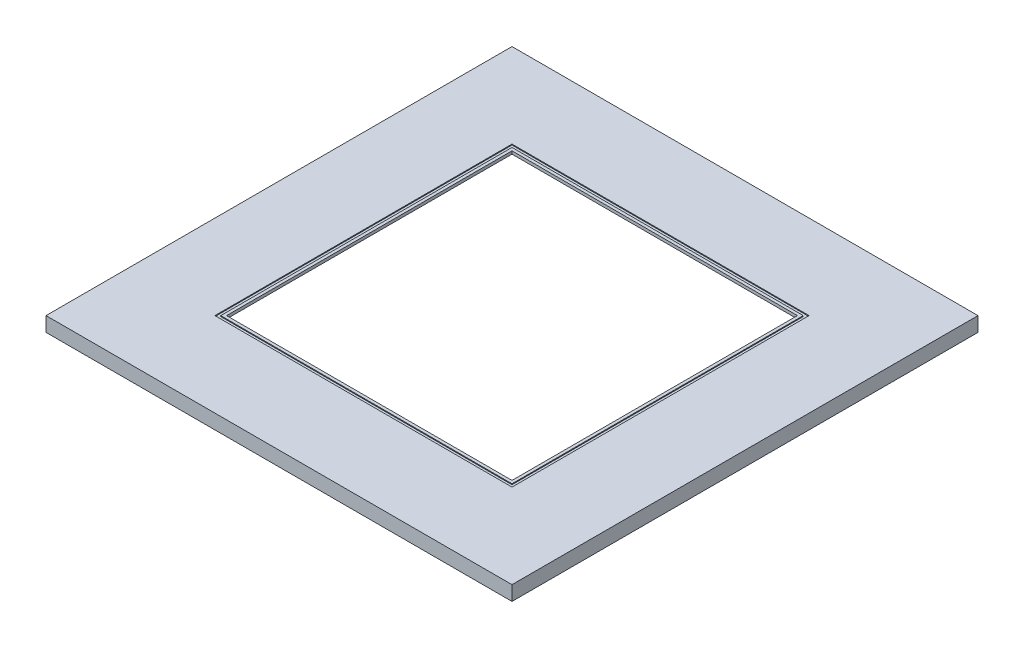
ISO-10303-21;
HEADER;
FILE_DESCRIPTION(('STEP AP214'),'2;1');
FILE_NAME('part.step','',(''),(''),'','','');
FILE_SCHEMA(('AUTOMOTIVE_DESIGN { 1 0 10303 214 1 1 1 1 }'));
ENDSEC;
DATA;
#1=APPLICATION_CONTEXT('core data for automotive mechanical design processes');
#2=APPLICATION_PROTOCOL_DEFINITION('international standard','automotive_design',2000,#1);
#3=PRODUCT_CONTEXT('',#1,'mechanical');
#4=PRODUCT('Part','Part','',(#3));
#5=PRODUCT_RELATED_PRODUCT_CATEGORY('part','',(#4));
#6=PRODUCT_DEFINITION_FORMATION('','',#4);
#7=PRODUCT_DEFINITION_CONTEXT('part definition',#1,'design');
#8=PRODUCT_DEFINITION('design','',#6,#7);
#9=PRODUCT_DEFINITION_SHAPE('','',#8);
#10=(LENGTH_UNIT() NAMED_UNIT(*) SI_UNIT(.MILLI.,.METRE.));
#11=(NAMED_UNIT(*) PLANE_ANGLE_UNIT() SI_UNIT($,.RADIAN.));
#12=(NAMED_UNIT(*) SI_UNIT($,.STERADIAN.) SOLID_ANGLE_UNIT());
#13=UNCERTAINTY_MEASURE_WITH_UNIT(LENGTH_MEASURE(1.E-05),#10,'distance_accuracy_value','');
#14=(GEOMETRIC_REPRESENTATION_CONTEXT(3) GLOBAL_UNCERTAINTY_ASSIGNED_CONTEXT((#13)) GLOBAL_UNIT_ASSIGNED_CONTEXT((#10,
#11,#12)) REPRESENTATION_CONTEXT('',''));
#15=CARTESIAN_POINT('',(0.,0.,0.));
#16=DIRECTION('',(0.,0.,1.));
#17=DIRECTION('',(1.,0.,0.));
#18=AXIS2_PLACEMENT_3D('',#15,#16,#17);
#19=CARTESIAN_POINT('',(0.,5.,0.));
#20=DIRECTION('',(0.,1.,0.));
#21=DIRECTION('',(0.,0.,1.));
#22=AXIS2_PLACEMENT_3D('',#19,#20,#21);
#23=PLANE('',#22);
#24=DIRECTION('',(0.,0.,1.));
#25=VECTOR('',#24,1.);
#26=CARTESIAN_POINT('',(26.,5.,-124.));
#27=LINE('',#26,#25);
#28=CARTESIAN_POINT('',(26.,5.,-124.));
#29=VERTEX_POINT('',#28);
#30=CARTESIAN_POINT('',(26.,5.,-26.));
#31=VERTEX_POINT('',#30);
#32=EDGE_CURVE('E236',#29,#31,#27,.T.);
#33=ORIENTED_EDGE('',*,*,#32,.F.);
#34=DIRECTION('',(-1.,0.,0.));
#35=VECTOR('',#34,1.);
#36=CARTESIAN_POINT('',(124.,5.,-124.));
#37=LINE('',#36,#35);
#38=CARTESIAN_POINT('',(124.,5.,-124.));
#39=VERTEX_POINT('',#38);
#40=EDGE_CURVE('E246',#39,#29,#37,.T.);
#41=ORIENTED_EDGE('',*,*,#40,.F.);
#42=DIRECTION('',(0.,0.,-1.));
#43=VECTOR('',#42,1.);
#44=CARTESIAN_POINT('',(124.,5.,-26.));
#45=LINE('',#44,#43);
#46=CARTESIAN_POINT('',(124.,5.,-26.));
#47=VERTEX_POINT('',#46);
#48=EDGE_CURVE('E260',#47,#39,#45,.T.);
#49=ORIENTED_EDGE('',*,*,#48,.F.);
#50=DIRECTION('',(1.,0.,0.));
#51=VECTOR('',#50,1.);
#52=CARTESIAN_POINT('',(26.,5.,-26.));
#53=LINE('',#52,#51);
#54=EDGE_CURVE('E257',#31,#47,#53,.T.);
#55=ORIENTED_EDGE('',*,*,#54,.F.);
#56=EDGE_LOOP('',(#33,#41,#49,#55));
#57=FACE_BOUND('',#56,.T.);
#58=DIRECTION('',(-1.,0.,0.));
#59=VECTOR('',#58,1.);
#60=CARTESIAN_POINT('',(125.,5.,-125.));
#61=LINE('',#60,#59);
#62=CARTESIAN_POINT('',(125.,5.,-125.));
#63=VERTEX_POINT('',#62);
#64=CARTESIAN_POINT('',(25.,5.,-125.));
#65=VERTEX_POINT('',#64);
#66=EDGE_CURVE('E196',#63,#65,#61,.T.);
#67=ORIENTED_EDGE('',*,*,#66,.T.);
#68=DIRECTION('',(0.,0.,1.));
#69=VECTOR('',#68,1.);
#70=CARTESIAN_POINT('',(25.,5.,-125.));
#71=LINE('',#70,#69);
#72=CARTESIAN_POINT('',(25.,5.,-25.));
#73=VERTEX_POINT('',#72);
#74=EDGE_CURVE('E203',#65,#73,#71,.T.);
#75=ORIENTED_EDGE('',*,*,#74,.T.);
#76=DIRECTION('',(1.,0.,0.));
#77=VECTOR('',#76,1.);
#78=CARTESIAN_POINT('',(25.,5.,-25.));
#79=LINE('',#78,#77);
#80=CARTESIAN_POINT('',(125.,5.,-25.));
#81=VERTEX_POINT('',#80);
#82=EDGE_CURVE('E176',#73,#81,#79,.T.);
#83=ORIENTED_EDGE('',*,*,#82,.T.);
#84=DIRECTION('',(0.,0.,-1.));
#85=VECTOR('',#84,1.);
#86=CARTESIAN_POINT('',(125.,5.,-25.));
#87=LINE('',#86,#85);
#88=EDGE_CURVE('E56',#81,#63,#87,.T.);
#89=ORIENTED_EDGE('',*,*,#88,.T.);
#90=EDGE_LOOP('',(#67,#75,#83,#89));
#91=FACE_BOUND('',#90,.T.);
#92=ADVANCED_FACE('F33',(#57,#91),#23,.T.);
#93=CARTESIAN_POINT('',(0.,5.,0.));
#94=DIRECTION('',(1.,0.,0.));
#95=DIRECTION('',(0.,0.,-1.));
#96=AXIS2_PLACEMENT_3D('',#93,#94,#95);
#97=PLANE('',#96);
#98=DIRECTION('',(0.,-1.,0.));
#99=VECTOR('',#98,1.);
#100=CARTESIAN_POINT('',(0.,5.,-150.));
#101=LINE('',#100,#99);
#102=CARTESIAN_POINT('',(0.,4.,-150.));
#103=VERTEX_POINT('',#102);
#104=CARTESIAN_POINT('',(0.,0.,-150.));
#105=VERTEX_POINT('',#104);
#106=EDGE_CURVE('E297',#103,#105,#101,.T.);
#107=ORIENTED_EDGE('',*,*,#106,.F.);
#108=DIRECTION('',(0.,0.,1.));
#109=VECTOR('',#108,1.);
#110=CARTESIAN_POINT('',(0.,4.,-150.));
#111=LINE('',#110,#109);
#112=CARTESIAN_POINT('',(0.,4.,0.));
#113=VERTEX_POINT('',#112);
#114=EDGE_CURVE('E267',#103,#113,#111,.T.);
#115=ORIENTED_EDGE('',*,*,#114,.T.);
#116=DIRECTION('',(0.,-1.,0.));
#117=VECTOR('',#116,1.);
#118=CARTESIAN_POINT('',(0.,5.,0.));
#119=LINE('',#118,#117);
#120=CARTESIAN_POINT('',(0.,0.,0.));
#121=VERTEX_POINT('',#120);
#122=EDGE_CURVE('E303',#113,#121,#119,.T.);
#123=ORIENTED_EDGE('',*,*,#122,.T.);
#124=DIRECTION('',(0.,0.,1.));
#125=VECTOR('',#124,1.);
#126=CARTESIAN_POINT('',(0.,0.,0.));
#127=LINE('',#126,#125);
#128=EDGE_CURVE('E285',#105,#121,#127,.T.);
#129=ORIENTED_EDGE('',*,*,#128,.F.);
#130=EDGE_LOOP('',(#107,#115,#123,#129));
#131=FACE_BOUND('',#130,.T.);
#132=ADVANCED_FACE('F358',(#131),#97,.T.);
#133=CARTESIAN_POINT('',(0.,5.,0.));
#134=DIRECTION('',(0.,0.,-1.));
#135=DIRECTION('',(-1.,0.,0.));
#136=AXIS2_PLACEMENT_3D('',#133,#134,#135);
#137=PLANE('',#136);
#138=ORIENTED_EDGE('',*,*,#122,.F.);
#139=DIRECTION('',(1.,0.,0.));
#140=VECTOR('',#139,1.);
#141=CARTESIAN_POINT('',(0.,4.,0.));
#142=LINE('',#141,#140);
#143=CARTESIAN_POINT('',(150.,4.,0.));
#144=VERTEX_POINT('',#143);
#145=EDGE_CURVE('E276',#113,#144,#142,.T.);
#146=ORIENTED_EDGE('',*,*,#145,.T.);
#147=DIRECTION('',(0.,-1.,0.));
#148=VECTOR('',#147,1.);
#149=CARTESIAN_POINT('',(150.,5.,0.));
#150=LINE('',#149,#148);
#151=CARTESIAN_POINT('',(150.,0.,0.));
#152=VERTEX_POINT('',#151);
#153=EDGE_CURVE('E301',#144,#152,#150,.T.);
#154=ORIENTED_EDGE('',*,*,#153,.T.);
#155=DIRECTION('',(1.,0.,0.));
#156=VECTOR('',#155,1.);
#157=CARTESIAN_POINT('',(0.,0.,0.));
#158=LINE('',#157,#156);
#159=EDGE_CURVE('E288',#121,#152,#158,.T.);
#160=ORIENTED_EDGE('',*,*,#159,.F.);
#161=EDGE_LOOP('',(#138,#146,#154,#160));
#162=FACE_BOUND('',#161,.T.);
#163=ADVANCED_FACE('F364',(#162),#137,.T.);
#164=CARTESIAN_POINT('',(150.,5.,0.));
#165=DIRECTION('',(-1.,0.,0.));
#166=DIRECTION('',(0.,0.,1.));
#167=AXIS2_PLACEMENT_3D('',#164,#165,#166);
#168=PLANE('',#167);
#169=ORIENTED_EDGE('',*,*,#153,.F.);
#170=DIRECTION('',(0.,0.,-1.));
#171=VECTOR('',#170,1.);
#172=CARTESIAN_POINT('',(150.,4.,0.));
#173=LINE('',#172,#171);
#174=CARTESIAN_POINT('',(150.,4.,-150.));
#175=VERTEX_POINT('',#174);
#176=EDGE_CURVE('E279',#144,#175,#173,.T.);
#177=ORIENTED_EDGE('',*,*,#176,.T.);
#178=DIRECTION('',(0.,-1.,0.));
#179=VECTOR('',#178,1.);
#180=CARTESIAN_POINT('',(150.,5.,-150.));
#181=LINE('',#180,#179);
#182=CARTESIAN_POINT('',(150.,0.,-150.));
#183=VERTEX_POINT('',#182);
#184=EDGE_CURVE('E299',#175,#183,#181,.T.);
#185=ORIENTED_EDGE('',*,*,#184,.T.);
#186=DIRECTION('',(0.,0.,-1.));
#187=VECTOR('',#186,1.);
#188=CARTESIAN_POINT('',(150.,0.,0.));
#189=LINE('',#188,#187);
#190=EDGE_CURVE('E291',#152,#183,#189,.T.);
#191=ORIENTED_EDGE('',*,*,#190,.F.);
#192=EDGE_LOOP('',(#169,#177,#185,#191));
#193=FACE_BOUND('',#192,.T.);
#194=ADVANCED_FACE('F377',(#193),#168,.T.);
#195=CARTESIAN_POINT('',(0.,5.,-150.));
#196=DIRECTION('',(0.,0.,1.));
#197=DIRECTION('',(1.,0.,0.));
#198=AXIS2_PLACEMENT_3D('',#195,#196,#197);
#199=PLANE('',#198);
#200=ORIENTED_EDGE('',*,*,#184,.F.);
#201=DIRECTION('',(-1.,0.,0.));
#202=VECTOR('',#201,1.);
#203=CARTESIAN_POINT('',(150.,4.,-150.));
#204=LINE('',#203,#202);
#205=EDGE_CURVE('E282',#175,#103,#204,.T.);
#206=ORIENTED_EDGE('',*,*,#205,.T.);
#207=ORIENTED_EDGE('',*,*,#106,.T.);
#208=DIRECTION('',(-1.,0.,0.));
#209=VECTOR('',#208,1.);
#210=CARTESIAN_POINT('',(0.,0.,-150.));
#211=LINE('',#210,#209);
#212=EDGE_CURVE('E294',#183,#105,#211,.T.);
#213=ORIENTED_EDGE('',*,*,#212,.F.);
#214=EDGE_LOOP('',(#200,#206,#207,#213));
#215=FACE_BOUND('',#214,.T.);
#216=ADVANCED_FACE('F371',(#215),#199,.T.);
#217=DIRECTION('',(0.,0.,1.));
#218=VECTOR('',#217,1.);
#219=CARTESIAN_POINT('',(24.,5.,-126.));
#220=LINE('',#219,#218);
#221=CARTESIAN_POINT('',(24.,5.,-126.));
#222=VERTEX_POINT('',#221);
#223=CARTESIAN_POINT('',(24.,5.,-24.));
#224=VERTEX_POINT('',#223);
#225=EDGE_CURVE('E48',#222,#224,#220,.T.);
#226=ORIENTED_EDGE('',*,*,#225,.F.);
#227=DIRECTION('',(-1.,0.,0.));
#228=VECTOR('',#227,1.);
#229=CARTESIAN_POINT('',(126.,5.,-126.));
#230=LINE('',#229,#228);
#231=CARTESIAN_POINT('',(126.,5.,-126.));
#232=VERTEX_POINT('',#231);
#233=EDGE_CURVE('E215',#232,#222,#230,.T.);
#234=ORIENTED_EDGE('',*,*,#233,.F.);
#235=DIRECTION('',(0.,0.,-1.));
#236=VECTOR('',#235,1.);
#237=CARTESIAN_POINT('',(126.,5.,-24.));
#238=LINE('',#237,#236);
#239=CARTESIAN_POINT('',(126.,5.,-24.));
#240=VERTEX_POINT('',#239);
#241=EDGE_CURVE('E229',#240,#232,#238,.T.);
#242=ORIENTED_EDGE('',*,*,#241,.F.);
#243=DIRECTION('',(1.,0.,0.));
#244=VECTOR('',#243,1.);
#245=CARTESIAN_POINT('',(24.,5.,-24.));
#246=LINE('',#245,#244);
#247=EDGE_CURVE('E226',#224,#240,#246,.T.);
#248=ORIENTED_EDGE('',*,*,#247,.F.);
#249=EDGE_LOOP('',(#226,#234,#242,#248));
#250=FACE_BOUND('',#249,.T.);
#251=DIRECTION('',(1.,0.,0.));
#252=VECTOR('',#251,1.);
#253=CARTESIAN_POINT('',(-5.,5.,5.));
#254=LINE('',#253,#252);
#255=CARTESIAN_POINT('',(-5.,5.,5.));
#256=VERTEX_POINT('',#255);
#257=CARTESIAN_POINT('',(155.,5.,5.));
#258=VERTEX_POINT('',#257);
#259=EDGE_CURVE('E306',#256,#258,#254,.T.);
#260=ORIENTED_EDGE('',*,*,#259,.T.);
#261=DIRECTION('',(0.,0.,-1.));
#262=VECTOR('',#261,1.);
#263=CARTESIAN_POINT('',(155.,5.,5.));
#264=LINE('',#263,#262);
#265=CARTESIAN_POINT('',(155.,5.,-155.));
#266=VERTEX_POINT('',#265);
#267=EDGE_CURVE('E309',#258,#266,#264,.T.);
#268=ORIENTED_EDGE('',*,*,#267,.T.);
#269=DIRECTION('',(-1.,0.,0.));
#270=VECTOR('',#269,1.);
#271=CARTESIAN_POINT('',(-5.,5.,-155.));
#272=LINE('',#271,#270);
#273=CARTESIAN_POINT('',(-5.,5.,-155.));
#274=VERTEX_POINT('',#273);
#275=EDGE_CURVE('E312',#266,#274,#272,.T.);
#276=ORIENTED_EDGE('',*,*,#275,.T.);
#277=DIRECTION('',(0.,0.,1.));
#278=VECTOR('',#277,1.);
#279=CARTESIAN_POINT('',(-5.,5.,5.));
#280=LINE('',#279,#278);
#281=EDGE_CURVE('E314',#274,#256,#280,.T.);
#282=ORIENTED_EDGE('',*,*,#281,.T.);
#283=EDGE_LOOP('',(#260,#268,#276,#282));
#284=FACE_BOUND('',#283,.T.);
#285=ADVANCED_FACE('F349',(#250,#284),#23,.T.);
#286=CARTESIAN_POINT('',(0.,0.,0.));
#287=DIRECTION('',(0.,1.,0.));
#288=DIRECTION('',(0.,0.,1.));
#289=AXIS2_PLACEMENT_3D('',#286,#287,#288);
#290=PLANE('',#289);
#291=DIRECTION('',(1.,0.,0.));
#292=VECTOR('',#291,1.);
#293=CARTESIAN_POINT('',(-5.,0.,5.));
#294=LINE('',#293,#292);
#295=CARTESIAN_POINT('',(-5.,0.,5.));
#296=VERTEX_POINT('',#295);
#297=CARTESIAN_POINT('',(155.,0.,5.));
#298=VERTEX_POINT('',#297);
#299=EDGE_CURVE('E305',#296,#298,#294,.T.);
#300=ORIENTED_EDGE('',*,*,#299,.F.);
#301=DIRECTION('',(0.,0.,1.));
#302=VECTOR('',#301,1.);
#303=CARTESIAN_POINT('',(-5.,0.,5.));
#304=LINE('',#303,#302);
#305=CARTESIAN_POINT('',(-5.,0.,-155.));
#306=VERTEX_POINT('',#305);
#307=EDGE_CURVE('E310',#306,#296,#304,.T.);
#308=ORIENTED_EDGE('',*,*,#307,.F.);
#309=DIRECTION('',(-1.,0.,0.));
#310=VECTOR('',#309,1.);
#311=CARTESIAN_POINT('',(-5.,0.,-155.));
#312=LINE('',#311,#310);
#313=CARTESIAN_POINT('',(155.,0.,-155.));
#314=VERTEX_POINT('',#313);
#315=EDGE_CURVE('E321',#314,#306,#312,.T.);
#316=ORIENTED_EDGE('',*,*,#315,.F.);
#317=DIRECTION('',(0.,0.,-1.));
#318=VECTOR('',#317,1.);
#319=CARTESIAN_POINT('',(155.,0.,5.));
#320=LINE('',#319,#318);
#321=EDGE_CURVE('E319',#298,#314,#320,.T.);
#322=ORIENTED_EDGE('',*,*,#321,.F.);
#323=EDGE_LOOP('',(#300,#308,#316,#322));
#324=FACE_BOUND('',#323,.T.);
#325=ORIENTED_EDGE('',*,*,#128,.T.);
#326=ORIENTED_EDGE('',*,*,#159,.T.);
#327=ORIENTED_EDGE('',*,*,#190,.T.);
#328=ORIENTED_EDGE('',*,*,#212,.T.);
#329=EDGE_LOOP('',(#325,#326,#327,#328));
#330=FACE_BOUND('',#329,.T.);
#331=ADVANCED_FACE('F339',(#324,#330),#290,.F.);
#332=CARTESIAN_POINT('',(-5.,5.,5.));
#333=DIRECTION('',(0.,0.,-1.));
#334=DIRECTION('',(-1.,0.,0.));
#335=AXIS2_PLACEMENT_3D('',#332,#333,#334);
#336=PLANE('',#335);
#337=ORIENTED_EDGE('',*,*,#299,.T.);
#338=DIRECTION('',(0.,-1.,0.));
#339=VECTOR('',#338,1.);
#340=CARTESIAN_POINT('',(155.,5.,5.));
#341=LINE('',#340,#339);
#342=EDGE_CURVE('E11',#258,#298,#341,.T.);
#343=ORIENTED_EDGE('',*,*,#342,.F.);
#344=ORIENTED_EDGE('',*,*,#259,.F.);
#345=DIRECTION('',(0.,-1.,0.));
#346=VECTOR('',#345,1.);
#347=CARTESIAN_POINT('',(-5.,5.,5.));
#348=LINE('',#347,#346);
#349=EDGE_CURVE('E316',#256,#296,#348,.T.);
#350=ORIENTED_EDGE('',*,*,#349,.T.);
#351=EDGE_LOOP('',(#337,#343,#344,#350));
#352=FACE_BOUND('',#351,.T.);
#353=ADVANCED_FACE('F35',(#352),#336,.F.);
#354=CARTESIAN_POINT('',(155.,5.,5.));
#355=DIRECTION('',(-1.,0.,0.));
#356=DIRECTION('',(0.,0.,1.));
#357=AXIS2_PLACEMENT_3D('',#354,#355,#356);
#358=PLANE('',#357);
#359=ORIENTED_EDGE('',*,*,#321,.T.);
#360=DIRECTION('',(0.,-1.,0.));
#361=VECTOR('',#360,1.);
#362=CARTESIAN_POINT('',(155.,5.,-155.));
#363=LINE('',#362,#361);
#364=EDGE_CURVE('E41',#266,#314,#363,.T.);
#365=ORIENTED_EDGE('',*,*,#364,.F.);
#366=ORIENTED_EDGE('',*,*,#267,.F.);
#367=ORIENTED_EDGE('',*,*,#342,.T.);
#368=EDGE_LOOP('',(#359,#365,#366,#367));
#369=FACE_BOUND('',#368,.T.);
#370=ADVANCED_FACE('F350',(#369),#358,.F.);
#371=CARTESIAN_POINT('',(-5.,5.,-155.));
#372=DIRECTION('',(0.,0.,1.));
#373=DIRECTION('',(1.,0.,0.));
#374=AXIS2_PLACEMENT_3D('',#371,#372,#373);
#375=PLANE('',#374);
#376=ORIENTED_EDGE('',*,*,#315,.T.);
#377=DIRECTION('',(0.,-1.,0.));
#378=VECTOR('',#377,1.);
#379=CARTESIAN_POINT('',(-5.,5.,-155.));
#380=LINE('',#379,#378);
#381=EDGE_CURVE('E326',#274,#306,#380,.T.);
#382=ORIENTED_EDGE('',*,*,#381,.F.);
#383=ORIENTED_EDGE('',*,*,#275,.F.);
#384=ORIENTED_EDGE('',*,*,#364,.T.);
#385=EDGE_LOOP('',(#376,#382,#383,#384));
#386=FACE_BOUND('',#385,.T.);
#387=ADVANCED_FACE('F333',(#386),#375,.F.);
#388=CARTESIAN_POINT('',(-5.,5.,5.));
#389=DIRECTION('',(1.,0.,0.));
#390=DIRECTION('',(0.,0.,-1.));
#391=AXIS2_PLACEMENT_3D('',#388,#389,#390);
#392=PLANE('',#391);
#393=ORIENTED_EDGE('',*,*,#307,.T.);
#394=ORIENTED_EDGE('',*,*,#349,.F.);
#395=ORIENTED_EDGE('',*,*,#281,.F.);
#396=ORIENTED_EDGE('',*,*,#381,.T.);
#397=EDGE_LOOP('',(#393,#394,#395,#396));
#398=FACE_BOUND('',#397,.T.);
#399=ADVANCED_FACE('F343',(#398),#392,.F.);
#400=CARTESIAN_POINT('',(0.,4.,0.));
#401=DIRECTION('',(0.,1.,0.));
#402=DIRECTION('',(0.,0.,1.));
#403=AXIS2_PLACEMENT_3D('',#400,#401,#402);
#404=PLANE('',#403);
#405=DIRECTION('',(-1.,0.,0.));
#406=VECTOR('',#405,1.);
#407=CARTESIAN_POINT('',(124.,4.,-124.));
#408=LINE('',#407,#406);
#409=CARTESIAN_POINT('',(124.,4.,-124.));
#410=VERTEX_POINT('',#409);
#411=CARTESIAN_POINT('',(26.,4.,-124.));
#412=VERTEX_POINT('',#411);
#413=EDGE_CURVE('E252',#410,#412,#408,.T.);
#414=ORIENTED_EDGE('',*,*,#413,.T.);
#415=DIRECTION('',(0.,0.,1.));
#416=VECTOR('',#415,1.);
#417=CARTESIAN_POINT('',(26.,4.,-124.));
#418=LINE('',#417,#416);
#419=CARTESIAN_POINT('',(26.,4.,-26.));
#420=VERTEX_POINT('',#419);
#421=EDGE_CURVE('E242',#412,#420,#418,.T.);
#422=ORIENTED_EDGE('',*,*,#421,.T.);
#423=DIRECTION('',(1.,0.,0.));
#424=VECTOR('',#423,1.);
#425=CARTESIAN_POINT('',(26.,4.,-26.));
#426=LINE('',#425,#424);
#427=CARTESIAN_POINT('',(124.,4.,-26.));
#428=VERTEX_POINT('',#427);
#429=EDGE_CURVE('E245',#420,#428,#426,.T.);
#430=ORIENTED_EDGE('',*,*,#429,.T.);
#431=DIRECTION('',(0.,0.,-1.));
#432=VECTOR('',#431,1.);
#433=CARTESIAN_POINT('',(124.,4.,-26.));
#434=LINE('',#433,#432);
#435=EDGE_CURVE('E249',#428,#410,#434,.T.);
#436=ORIENTED_EDGE('',*,*,#435,.T.);
#437=EDGE_LOOP('',(#414,#422,#430,#436));
#438=FACE_BOUND('',#437,.T.);
#439=ORIENTED_EDGE('',*,*,#114,.F.);
#440=ORIENTED_EDGE('',*,*,#205,.F.);
#441=ORIENTED_EDGE('',*,*,#176,.F.);
#442=ORIENTED_EDGE('',*,*,#145,.F.);
#443=EDGE_LOOP('',(#439,#440,#441,#442));
#444=FACE_BOUND('',#443,.T.);
#445=ADVANCED_FACE('F421',(#438,#444),#404,.F.);
#446=CARTESIAN_POINT('',(26.,4.,-124.));
#447=DIRECTION('',(-1.,0.,0.));
#448=DIRECTION('',(0.,0.,1.));
#449=AXIS2_PLACEMENT_3D('',#446,#447,#448);
#450=PLANE('',#449);
#451=ORIENTED_EDGE('',*,*,#32,.T.);
#452=DIRECTION('',(0.,1.,0.));
#453=VECTOR('',#452,1.);
#454=CARTESIAN_POINT('',(26.,4.,-26.));
#455=LINE('',#454,#453);
#456=EDGE_CURVE('E255',#420,#31,#455,.T.);
#457=ORIENTED_EDGE('',*,*,#456,.F.);
#458=ORIENTED_EDGE('',*,*,#421,.F.);
#459=DIRECTION('',(0.,1.,0.));
#460=VECTOR('',#459,1.);
#461=CARTESIAN_POINT('',(26.,4.,-124.));
#462=LINE('',#461,#460);
#463=EDGE_CURVE('E265',#412,#29,#462,.T.);
#464=ORIENTED_EDGE('',*,*,#463,.T.);
#465=EDGE_LOOP('',(#451,#457,#458,#464));
#466=FACE_BOUND('',#465,.T.);
#467=ADVANCED_FACE('F411',(#466),#450,.F.);
#468=CARTESIAN_POINT('',(124.,4.,-124.));
#469=DIRECTION('',(0.,0.,-1.));
#470=DIRECTION('',(-1.,0.,0.));
#471=AXIS2_PLACEMENT_3D('',#468,#469,#470);
#472=PLANE('',#471);
#473=ORIENTED_EDGE('',*,*,#40,.T.);
#474=ORIENTED_EDGE('',*,*,#463,.F.);
#475=ORIENTED_EDGE('',*,*,#413,.F.);
#476=DIRECTION('',(0.,1.,0.));
#477=VECTOR('',#476,1.);
#478=CARTESIAN_POINT('',(124.,4.,-124.));
#479=LINE('',#478,#477);
#480=EDGE_CURVE('E268',#410,#39,#479,.T.);
#481=ORIENTED_EDGE('',*,*,#480,.T.);
#482=EDGE_LOOP('',(#473,#474,#475,#481));
#483=FACE_BOUND('',#482,.T.);
#484=ADVANCED_FACE('F407',(#483),#472,.F.);
#485=CARTESIAN_POINT('',(124.,4.,-26.));
#486=DIRECTION('',(1.,0.,0.));
#487=DIRECTION('',(0.,0.,-1.));
#488=AXIS2_PLACEMENT_3D('',#485,#486,#487);
#489=PLANE('',#488);
#490=ORIENTED_EDGE('',*,*,#48,.T.);
#491=ORIENTED_EDGE('',*,*,#480,.F.);
#492=ORIENTED_EDGE('',*,*,#435,.F.);
#493=DIRECTION('',(0.,1.,0.));
#494=VECTOR('',#493,1.);
#495=CARTESIAN_POINT('',(124.,4.,-26.));
#496=LINE('',#495,#494);
#497=EDGE_CURVE('E270',#428,#47,#496,.T.);
#498=ORIENTED_EDGE('',*,*,#497,.T.);
#499=EDGE_LOOP('',(#490,#491,#492,#498));
#500=FACE_BOUND('',#499,.T.);
#501=ADVANCED_FACE('F410',(#500),#489,.F.);
#502=CARTESIAN_POINT('',(26.,4.,-26.));
#503=DIRECTION('',(0.,0.,1.));
#504=DIRECTION('',(1.,0.,0.));
#505=AXIS2_PLACEMENT_3D('',#502,#503,#504);
#506=PLANE('',#505);
#507=ORIENTED_EDGE('',*,*,#54,.T.);
#508=ORIENTED_EDGE('',*,*,#497,.F.);
#509=ORIENTED_EDGE('',*,*,#429,.F.);
#510=ORIENTED_EDGE('',*,*,#456,.T.);
#511=EDGE_LOOP('',(#507,#508,#509,#510));
#512=FACE_BOUND('',#511,.T.);
#513=ADVANCED_FACE('F406',(#512),#506,.F.);
#514=CARTESIAN_POINT('',(24.,4.7,-126.));
#515=DIRECTION('',(-1.,0.,0.));
#516=DIRECTION('',(0.,0.,1.));
#517=AXIS2_PLACEMENT_3D('',#514,#515,#516);
#518=PLANE('',#517);
#519=ORIENTED_EDGE('',*,*,#225,.T.);
#520=DIRECTION('',(0.,1.,0.));
#521=VECTOR('',#520,1.);
#522=CARTESIAN_POINT('',(24.,4.7,-24.));
#523=LINE('',#522,#521);
#524=CARTESIAN_POINT('',(24.,4.7,-24.));
#525=VERTEX_POINT('',#524);
#526=EDGE_CURVE('E224',#525,#224,#523,.T.);
#527=ORIENTED_EDGE('',*,*,#526,.F.);
#528=DIRECTION('',(0.,0.,1.));
#529=VECTOR('',#528,1.);
#530=CARTESIAN_POINT('',(24.,4.7,-126.));
#531=LINE('',#530,#529);
#532=CARTESIAN_POINT('',(24.,4.7,-126.));
#533=VERTEX_POINT('',#532);
#534=EDGE_CURVE('E211',#533,#525,#531,.T.);
#535=ORIENTED_EDGE('',*,*,#534,.F.);
#536=DIRECTION('',(0.,1.,0.));
#537=VECTOR('',#536,1.);
#538=CARTESIAN_POINT('',(24.,4.7,-126.));
#539=LINE('',#538,#537);
#540=EDGE_CURVE('E234',#533,#222,#539,.T.);
#541=ORIENTED_EDGE('',*,*,#540,.T.);
#542=EDGE_LOOP('',(#519,#527,#535,#541));
#543=FACE_BOUND('',#542,.T.);
#544=ADVANCED_FACE('F388',(#543),#518,.F.);
#545=CARTESIAN_POINT('',(126.,4.7,-126.));
#546=DIRECTION('',(0.,0.,-1.));
#547=DIRECTION('',(-1.,0.,0.));
#548=AXIS2_PLACEMENT_3D('',#545,#546,#547);
#549=PLANE('',#548);
#550=ORIENTED_EDGE('',*,*,#233,.T.);
#551=ORIENTED_EDGE('',*,*,#540,.F.);
#552=DIRECTION('',(-1.,0.,0.));
#553=VECTOR('',#552,1.);
#554=CARTESIAN_POINT('',(126.,4.7,-126.));
#555=LINE('',#554,#553);
#556=CARTESIAN_POINT('',(126.,4.7,-126.));
#557=VERTEX_POINT('',#556);
#558=EDGE_CURVE('E221',#557,#533,#555,.T.);
#559=ORIENTED_EDGE('',*,*,#558,.F.);
#560=DIRECTION('',(0.,1.,0.));
#561=VECTOR('',#560,1.);
#562=CARTESIAN_POINT('',(126.,4.7,-126.));
#563=LINE('',#562,#561);
#564=EDGE_CURVE('E237',#557,#232,#563,.T.);
#565=ORIENTED_EDGE('',*,*,#564,.T.);
#566=EDGE_LOOP('',(#550,#551,#559,#565));
#567=FACE_BOUND('',#566,.T.);
#568=ADVANCED_FACE('F391',(#567),#549,.F.);
#569=CARTESIAN_POINT('',(126.,4.7,-24.));
#570=DIRECTION('',(1.,0.,0.));
#571=DIRECTION('',(0.,0.,-1.));
#572=AXIS2_PLACEMENT_3D('',#569,#570,#571);
#573=PLANE('',#572);
#574=ORIENTED_EDGE('',*,*,#241,.T.);
#575=ORIENTED_EDGE('',*,*,#564,.F.);
#576=DIRECTION('',(0.,0.,-1.));
#577=VECTOR('',#576,1.);
#578=CARTESIAN_POINT('',(126.,4.7,-24.));
#579=LINE('',#578,#577);
#580=CARTESIAN_POINT('',(126.,4.7,-24.));
#581=VERTEX_POINT('',#580);
#582=EDGE_CURVE('E218',#581,#557,#579,.T.);
#583=ORIENTED_EDGE('',*,*,#582,.F.);
#584=DIRECTION('',(0.,1.,0.));
#585=VECTOR('',#584,1.);
#586=CARTESIAN_POINT('',(126.,4.7,-24.));
#587=LINE('',#586,#585);
#588=EDGE_CURVE('E239',#581,#240,#587,.T.);
#589=ORIENTED_EDGE('',*,*,#588,.T.);
#590=EDGE_LOOP('',(#574,#575,#583,#589));
#591=FACE_BOUND('',#590,.T.);
#592=ADVANCED_FACE('F393',(#591),#573,.F.);
#593=CARTESIAN_POINT('',(24.,4.7,-24.));
#594=DIRECTION('',(0.,0.,1.));
#595=DIRECTION('',(1.,0.,0.));
#596=AXIS2_PLACEMENT_3D('',#593,#594,#595);
#597=PLANE('',#596);
#598=ORIENTED_EDGE('',*,*,#247,.T.);
#599=ORIENTED_EDGE('',*,*,#588,.F.);
#600=DIRECTION('',(1.,0.,0.));
#601=VECTOR('',#600,1.);
#602=CARTESIAN_POINT('',(24.,4.7,-24.));
#603=LINE('',#602,#601);
#604=EDGE_CURVE('E214',#525,#581,#603,.T.);
#605=ORIENTED_EDGE('',*,*,#604,.F.);
#606=ORIENTED_EDGE('',*,*,#526,.T.);
#607=EDGE_LOOP('',(#598,#599,#605,#606));
#608=FACE_BOUND('',#607,.T.);
#609=ADVANCED_FACE('F384',(#608),#597,.F.);
#610=CARTESIAN_POINT('',(0.,4.7,0.));
#611=DIRECTION('',(0.,1.,0.));
#612=DIRECTION('',(0.,0.,1.));
#613=AXIS2_PLACEMENT_3D('',#610,#611,#612);
#614=PLANE('',#613);
#615=DIRECTION('',(-1.,0.,0.));
#616=VECTOR('',#615,1.);
#617=CARTESIAN_POINT('',(125.,4.7,-125.));
#618=LINE('',#617,#616);
#619=CARTESIAN_POINT('',(125.,4.7,-125.));
#620=VERTEX_POINT('',#619);
#621=CARTESIAN_POINT('',(25.,4.7,-125.));
#622=VERTEX_POINT('',#621);
#623=EDGE_CURVE('E182',#620,#622,#618,.T.);
#624=ORIENTED_EDGE('',*,*,#623,.F.);
#625=DIRECTION('',(0.,0.,-1.));
#626=VECTOR('',#625,1.);
#627=CARTESIAN_POINT('',(125.,4.7,-25.));
#628=LINE('',#627,#626);
#629=CARTESIAN_POINT('',(125.,4.7,-25.));
#630=VERTEX_POINT('',#629);
#631=EDGE_CURVE('E192',#630,#620,#628,.T.);
#632=ORIENTED_EDGE('',*,*,#631,.F.);
#633=DIRECTION('',(1.,0.,0.));
#634=VECTOR('',#633,1.);
#635=CARTESIAN_POINT('',(25.,4.7,-25.));
#636=LINE('',#635,#634);
#637=CARTESIAN_POINT('',(25.,4.7,-25.));
#638=VERTEX_POINT('',#637);
#639=EDGE_CURVE('E174',#638,#630,#636,.T.);
#640=ORIENTED_EDGE('',*,*,#639,.F.);
#641=DIRECTION('',(0.,0.,1.));
#642=VECTOR('',#641,1.);
#643=CARTESIAN_POINT('',(25.,4.7,-125.));
#644=LINE('',#643,#642);
#645=EDGE_CURVE('E189',#622,#638,#644,.T.);
#646=ORIENTED_EDGE('',*,*,#645,.F.);
#647=EDGE_LOOP('',(#624,#632,#640,#646));
#648=FACE_BOUND('',#647,.T.);
#649=ORIENTED_EDGE('',*,*,#534,.T.);
#650=ORIENTED_EDGE('',*,*,#604,.T.);
#651=ORIENTED_EDGE('',*,*,#582,.T.);
#652=ORIENTED_EDGE('',*,*,#558,.T.);
#653=EDGE_LOOP('',(#649,#650,#651,#652));
#654=FACE_BOUND('',#653,.T.);
#655=ADVANCED_FACE('F187',(#648,#654),#614,.T.);
#656=CARTESIAN_POINT('',(25.,4.7,-125.));
#657=DIRECTION('',(-1.,0.,0.));
#658=DIRECTION('',(0.,0.,1.));
#659=AXIS2_PLACEMENT_3D('',#656,#657,#658);
#660=PLANE('',#659);
#661=ORIENTED_EDGE('',*,*,#74,.F.);
#662=DIRECTION('',(0.,1.,0.));
#663=VECTOR('',#662,1.);
#664=CARTESIAN_POINT('',(25.,4.7,-125.));
#665=LINE('',#664,#663);
#666=EDGE_CURVE('E195',#622,#65,#665,.T.);
#667=ORIENTED_EDGE('',*,*,#666,.F.);
#668=ORIENTED_EDGE('',*,*,#645,.T.);
#669=DIRECTION('',(0.,1.,0.));
#670=VECTOR('',#669,1.);
#671=CARTESIAN_POINT('',(25.,4.7,-25.));
#672=LINE('',#671,#670);
#673=EDGE_CURVE('E171',#638,#73,#672,.T.);
#674=ORIENTED_EDGE('',*,*,#673,.T.);
#675=EDGE_LOOP('',(#661,#667,#668,#674));
#676=FACE_BOUND('',#675,.T.);
#677=ADVANCED_FACE('F194',(#676),#660,.T.);
#678=CARTESIAN_POINT('',(125.,4.7,-125.));
#679=DIRECTION('',(0.,0.,-1.));
#680=DIRECTION('',(-1.,0.,0.));
#681=AXIS2_PLACEMENT_3D('',#678,#679,#680);
#682=PLANE('',#681);
#683=ORIENTED_EDGE('',*,*,#66,.F.);
#684=DIRECTION('',(0.,1.,0.));
#685=VECTOR('',#684,1.);
#686=CARTESIAN_POINT('',(125.,4.7,-125.));
#687=LINE('',#686,#685);
#688=EDGE_CURVE('E208',#620,#63,#687,.T.);
#689=ORIENTED_EDGE('',*,*,#688,.F.);
#690=ORIENTED_EDGE('',*,*,#623,.T.);
#691=ORIENTED_EDGE('',*,*,#666,.T.);
#692=EDGE_LOOP('',(#683,#689,#690,#691));
#693=FACE_BOUND('',#692,.T.);
#694=ADVANCED_FACE('F533',(#693),#682,.T.);
#695=CARTESIAN_POINT('',(125.,4.7,-25.));
#696=DIRECTION('',(1.,0.,0.));
#697=DIRECTION('',(0.,0.,-1.));
#698=AXIS2_PLACEMENT_3D('',#695,#696,#697);
#699=PLANE('',#698);
#700=ORIENTED_EDGE('',*,*,#88,.F.);
#701=DIRECTION('',(0.,1.,0.));
#702=VECTOR('',#701,1.);
#703=CARTESIAN_POINT('',(125.,4.7,-25.));
#704=LINE('',#703,#702);
#705=EDGE_CURVE('E181',#630,#81,#704,.T.);
#706=ORIENTED_EDGE('',*,*,#705,.F.);
#707=ORIENTED_EDGE('',*,*,#631,.T.);
#708=ORIENTED_EDGE('',*,*,#688,.T.);
#709=EDGE_LOOP('',(#700,#706,#707,#708));
#710=FACE_BOUND('',#709,.T.);
#711=ADVANCED_FACE('F542',(#710),#699,.T.);
#712=CARTESIAN_POINT('',(25.,4.7,-25.));
#713=DIRECTION('',(0.,0.,1.));
#714=DIRECTION('',(1.,0.,0.));
#715=AXIS2_PLACEMENT_3D('',#712,#713,#714);
#716=PLANE('',#715);
#717=ORIENTED_EDGE('',*,*,#82,.F.);
#718=ORIENTED_EDGE('',*,*,#673,.F.);
#719=ORIENTED_EDGE('',*,*,#639,.T.);
#720=ORIENTED_EDGE('',*,*,#705,.T.);
#721=EDGE_LOOP('',(#717,#718,#719,#720));
#722=FACE_BOUND('',#721,.T.);
#723=ADVANCED_FACE('F173',(#722),#716,.T.);
#724=CLOSED_SHELL('',(#92,#132,#163,#194,#216,#285,#331,#353,#370,#387,#399,#445,#467,#484,#501,
#513,#544,#568,#592,#609,#655,#677,#694,#711,#723));
#725=MANIFOLD_SOLID_BREP('B2',#724);
#726=ADVANCED_BREP_SHAPE_REPRESENTATION('',(#18,#725),#14);
#727=SHAPE_DEFINITION_REPRESENTATION(#9,#726);
ENDSEC;
END-ISO-10303-21;
